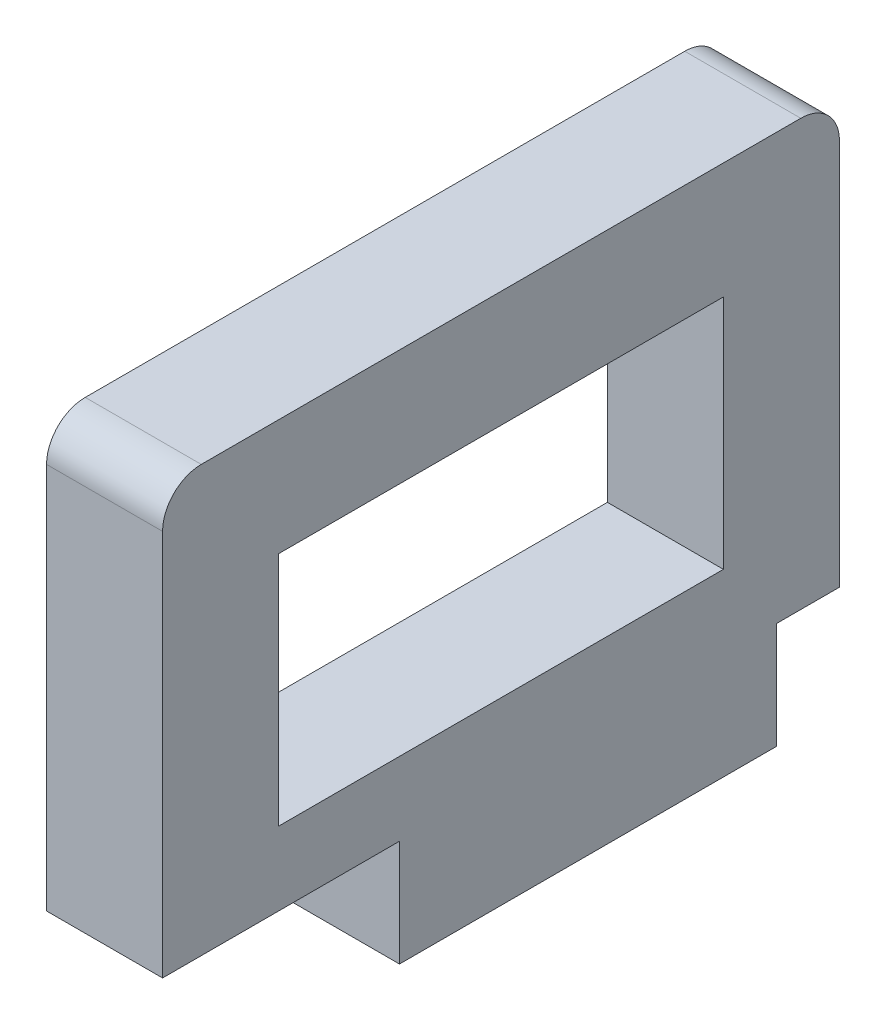
ISO-10303-21;
HEADER;
FILE_DESCRIPTION(('STEP AP214'),'2;1');
FILE_NAME('part.step','',(''),(''),'','','');
FILE_SCHEMA(('AUTOMOTIVE_DESIGN { 1 0 10303 214 1 1 1 1 }'));
ENDSEC;
DATA;
#1=APPLICATION_CONTEXT('core data for automotive mechanical design processes');
#2=APPLICATION_PROTOCOL_DEFINITION('international standard','automotive_design',2000,#1);
#3=PRODUCT_CONTEXT('',#1,'mechanical');
#4=PRODUCT('Part','Part','',(#3));
#5=PRODUCT_RELATED_PRODUCT_CATEGORY('part','',(#4));
#6=PRODUCT_DEFINITION_FORMATION('','',#4);
#7=PRODUCT_DEFINITION_CONTEXT('part definition',#1,'design');
#8=PRODUCT_DEFINITION('design','',#6,#7);
#9=PRODUCT_DEFINITION_SHAPE('','',#8);
#10=(LENGTH_UNIT() NAMED_UNIT(*) SI_UNIT(.MILLI.,.METRE.));
#11=(NAMED_UNIT(*) PLANE_ANGLE_UNIT() SI_UNIT($,.RADIAN.));
#12=(NAMED_UNIT(*) SI_UNIT($,.STERADIAN.) SOLID_ANGLE_UNIT());
#13=UNCERTAINTY_MEASURE_WITH_UNIT(LENGTH_MEASURE(1.E-05),#10,'distance_accuracy_value','');
#14=(GEOMETRIC_REPRESENTATION_CONTEXT(3) GLOBAL_UNCERTAINTY_ASSIGNED_CONTEXT((#13)) GLOBAL_UNIT_ASSIGNED_CONTEXT((#10,
#11,#12)) REPRESENTATION_CONTEXT('',''));
#15=CARTESIAN_POINT('',(0.,0.,0.));
#16=DIRECTION('',(0.,0.,1.));
#17=DIRECTION('',(1.,0.,0.));
#18=AXIS2_PLACEMENT_3D('',#15,#16,#17);
#19=CARTESIAN_POINT('',(6.,0.,0.));
#20=DIRECTION('',(1.,0.,0.));
#21=DIRECTION('',(0.,0.,-1.));
#22=AXIS2_PLACEMENT_3D('',#19,#20,#21);
#23=PLANE('',#22);
#24=DIRECTION('',(0.,0.,1.));
#25=VECTOR('',#24,1.);
#26=CARTESIAN_POINT('',(6.,12.1,-17.5));
#27=LINE('',#26,#25);
#28=CARTESIAN_POINT('',(6.,12.1,-15.5));
#29=VERTEX_POINT('',#28);
#30=CARTESIAN_POINT('',(6.,12.1,15.5));
#31=VERTEX_POINT('',#30);
#32=EDGE_CURVE('E178',#29,#31,#27,.T.);
#33=ORIENTED_EDGE('',*,*,#32,.T.);
#34=CARTESIAN_POINT('',(6.,10.1,15.5));
#35=DIRECTION('',(1.,0.,0.));
#36=DIRECTION('',(0.,0.,-1.));
#37=AXIS2_PLACEMENT_3D('',#34,#35,#36);
#38=CIRCLE('',#37,2.);
#39=CARTESIAN_POINT('',(6.,10.1,17.5));
#40=VERTEX_POINT('',#39);
#41=EDGE_CURVE('E41',#31,#40,#38,.T.);
#42=ORIENTED_EDGE('',*,*,#41,.T.);
#43=DIRECTION('',(0.,-1.,0.));
#44=VECTOR('',#43,1.);
#45=CARTESIAN_POINT('',(6.,12.1,17.5));
#46=LINE('',#45,#44);
#47=CARTESIAN_POINT('',(6.,-9.90000000000001,17.5));
#48=VERTEX_POINT('',#47);
#49=EDGE_CURVE('E180',#40,#48,#46,.T.);
#50=ORIENTED_EDGE('',*,*,#49,.T.);
#51=DIRECTION('',(0.,0.,-1.));
#52=VECTOR('',#51,1.);
#53=CARTESIAN_POINT('',(6.,-9.90000000000001,17.5));
#54=LINE('',#53,#52);
#55=CARTESIAN_POINT('',(6.,-9.90000000000001,5.24999999999999));
#56=VERTEX_POINT('',#55);
#57=EDGE_CURVE('E183',#48,#56,#54,.T.);
#58=ORIENTED_EDGE('',*,*,#57,.T.);
#59=DIRECTION('',(0.,-1.,0.));
#60=VECTOR('',#59,1.);
#61=CARTESIAN_POINT('',(6.,-9.90000000000001,5.24999999999999));
#62=LINE('',#61,#60);
#63=CARTESIAN_POINT('',(6.,-15.4,5.24999999999999));
#64=VERTEX_POINT('',#63);
#65=EDGE_CURVE('E185',#56,#64,#62,.T.);
#66=ORIENTED_EDGE('',*,*,#65,.T.);
#67=DIRECTION('',(0.,0.,-1.));
#68=VECTOR('',#67,1.);
#69=CARTESIAN_POINT('',(6.,-15.4,5.24999999999999));
#70=LINE('',#69,#68);
#71=CARTESIAN_POINT('',(6.,-15.4,-14.25));
#72=VERTEX_POINT('',#71);
#73=EDGE_CURVE('E187',#64,#72,#70,.T.);
#74=ORIENTED_EDGE('',*,*,#73,.T.);
#75=DIRECTION('',(0.,1.,0.));
#76=VECTOR('',#75,1.);
#77=CARTESIAN_POINT('',(6.,-15.4,-14.25));
#78=LINE('',#77,#76);
#79=CARTESIAN_POINT('',(6.,-9.90000000000001,-14.25));
#80=VERTEX_POINT('',#79);
#81=EDGE_CURVE('E189',#72,#80,#78,.T.);
#82=ORIENTED_EDGE('',*,*,#81,.T.);
#83=DIRECTION('',(0.,0.,-1.));
#84=VECTOR('',#83,1.);
#85=CARTESIAN_POINT('',(6.,-9.90000000000001,-14.25));
#86=LINE('',#85,#84);
#87=CARTESIAN_POINT('',(6.,-9.9,-17.5));
#88=VERTEX_POINT('',#87);
#89=EDGE_CURVE('E191',#80,#88,#86,.T.);
#90=ORIENTED_EDGE('',*,*,#89,.T.);
#91=DIRECTION('',(0.,1.,0.));
#92=VECTOR('',#91,1.);
#93=CARTESIAN_POINT('',(6.,-9.9,-17.5));
#94=LINE('',#93,#92);
#95=CARTESIAN_POINT('',(6.,10.1,-17.5));
#96=VERTEX_POINT('',#95);
#97=EDGE_CURVE('E193',#88,#96,#94,.T.);
#98=ORIENTED_EDGE('',*,*,#97,.T.);
#99=CARTESIAN_POINT('',(6.,10.1,-15.5));
#100=DIRECTION('',(1.,0.,0.));
#101=DIRECTION('',(0.,0.,-1.));
#102=AXIS2_PLACEMENT_3D('',#99,#100,#101);
#103=CIRCLE('',#102,2.);
#104=EDGE_CURVE('E238',#96,#29,#103,.T.);
#105=ORIENTED_EDGE('',*,*,#104,.T.);
#106=EDGE_LOOP('',(#33,#42,#50,#58,#66,#74,#82,#90,#98,#105));
#107=FACE_BOUND('',#106,.T.);
#108=DIRECTION('',(0.,0.,1.));
#109=VECTOR('',#108,1.);
#110=CARTESIAN_POINT('',(6.,6.1,11.5));
#111=LINE('',#110,#109);
#112=CARTESIAN_POINT('',(6.,6.1,-11.5));
#113=VERTEX_POINT('',#112);
#114=CARTESIAN_POINT('',(6.,6.1,11.5));
#115=VERTEX_POINT('',#114);
#116=EDGE_CURVE('E147',#113,#115,#111,.T.);
#117=ORIENTED_EDGE('',*,*,#116,.F.);
#118=DIRECTION('',(0.,1.,0.));
#119=VECTOR('',#118,1.);
#120=CARTESIAN_POINT('',(6.,-6.1,-11.5));
#121=LINE('',#120,#119);
#122=CARTESIAN_POINT('',(6.,-6.1,-11.5));
#123=VERTEX_POINT('',#122);
#124=EDGE_CURVE('E137',#123,#113,#121,.T.);
#125=ORIENTED_EDGE('',*,*,#124,.F.);
#126=DIRECTION('',(0.,0.,-1.));
#127=VECTOR('',#126,1.);
#128=CARTESIAN_POINT('',(6.,-6.1,11.5));
#129=LINE('',#128,#127);
#130=CARTESIAN_POINT('',(6.,-6.1,11.5));
#131=VERTEX_POINT('',#130);
#132=EDGE_CURVE('E162',#131,#123,#129,.T.);
#133=ORIENTED_EDGE('',*,*,#132,.F.);
#134=DIRECTION('',(0.,-1.,0.));
#135=VECTOR('',#134,1.);
#136=CARTESIAN_POINT('',(6.,-6.1,11.5));
#137=LINE('',#136,#135);
#138=EDGE_CURVE('E160',#115,#131,#137,.T.);
#139=ORIENTED_EDGE('',*,*,#138,.F.);
#140=EDGE_LOOP('',(#117,#125,#133,#139));
#141=FACE_BOUND('',#140,.T.);
#142=ADVANCED_FACE('F33',(#107,#141),#23,.T.);
#143=CARTESIAN_POINT('',(0.,0.,0.));
#144=DIRECTION('',(1.,0.,0.));
#145=DIRECTION('',(0.,0.,-1.));
#146=AXIS2_PLACEMENT_3D('',#143,#144,#145);
#147=PLANE('',#146);
#148=DIRECTION('',(0.,-1.,0.));
#149=VECTOR('',#148,1.);
#150=CARTESIAN_POINT('',(0.,12.1,17.5));
#151=LINE('',#150,#149);
#152=CARTESIAN_POINT('',(0.,10.1,17.5));
#153=VERTEX_POINT('',#152);
#154=CARTESIAN_POINT('',(0.,-9.90000000000001,17.5));
#155=VERTEX_POINT('',#154);
#156=EDGE_CURVE('E197',#153,#155,#151,.T.);
#157=ORIENTED_EDGE('',*,*,#156,.F.);
#158=CARTESIAN_POINT('',(0.,10.1,15.5));
#159=DIRECTION('',(1.,0.,0.));
#160=DIRECTION('',(0.,0.,-1.));
#161=AXIS2_PLACEMENT_3D('',#158,#159,#160);
#162=CIRCLE('',#161,2.);
#163=CARTESIAN_POINT('',(0.,12.1,15.5));
#164=VERTEX_POINT('',#163);
#165=EDGE_CURVE('E232',#153,#164,#162,.F.);
#166=ORIENTED_EDGE('',*,*,#165,.T.);
#167=DIRECTION('',(0.,0.,1.));
#168=VECTOR('',#167,1.);
#169=CARTESIAN_POINT('',(0.,12.1,-17.5));
#170=LINE('',#169,#168);
#171=CARTESIAN_POINT('',(0.,12.1,-15.5));
#172=VERTEX_POINT('',#171);
#173=EDGE_CURVE('E155',#172,#164,#170,.T.);
#174=ORIENTED_EDGE('',*,*,#173,.F.);
#175=CARTESIAN_POINT('',(0.,10.1,-15.5));
#176=DIRECTION('',(1.,0.,0.));
#177=DIRECTION('',(0.,0.,-1.));
#178=AXIS2_PLACEMENT_3D('',#175,#176,#177);
#179=CIRCLE('',#178,2.);
#180=CARTESIAN_POINT('',(0.,10.1,-17.5));
#181=VERTEX_POINT('',#180);
#182=EDGE_CURVE('E230',#172,#181,#179,.F.);
#183=ORIENTED_EDGE('',*,*,#182,.T.);
#184=DIRECTION('',(0.,1.,0.));
#185=VECTOR('',#184,1.);
#186=CARTESIAN_POINT('',(0.,-9.9,-17.5));
#187=LINE('',#186,#185);
#188=CARTESIAN_POINT('',(0.,-9.9,-17.5));
#189=VERTEX_POINT('',#188);
#190=EDGE_CURVE('E181',#189,#181,#187,.T.);
#191=ORIENTED_EDGE('',*,*,#190,.F.);
#192=DIRECTION('',(0.,0.,-1.));
#193=VECTOR('',#192,1.);
#194=CARTESIAN_POINT('',(0.,-9.90000000000001,-14.25));
#195=LINE('',#194,#193);
#196=CARTESIAN_POINT('',(0.,-9.90000000000001,-14.25));
#197=VERTEX_POINT('',#196);
#198=EDGE_CURVE('E207',#197,#189,#195,.T.);
#199=ORIENTED_EDGE('',*,*,#198,.F.);
#200=DIRECTION('',(0.,1.,0.));
#201=VECTOR('',#200,1.);
#202=CARTESIAN_POINT('',(0.,-15.4,-14.25));
#203=LINE('',#202,#201);
#204=CARTESIAN_POINT('',(0.,-15.4,-14.25));
#205=VERTEX_POINT('',#204);
#206=EDGE_CURVE('E205',#205,#197,#203,.T.);
#207=ORIENTED_EDGE('',*,*,#206,.F.);
#208=DIRECTION('',(0.,0.,-1.));
#209=VECTOR('',#208,1.);
#210=CARTESIAN_POINT('',(0.,-15.4,5.24999999999999));
#211=LINE('',#210,#209);
#212=CARTESIAN_POINT('',(0.,-15.4,5.24999999999999));
#213=VERTEX_POINT('',#212);
#214=EDGE_CURVE('E203',#213,#205,#211,.T.);
#215=ORIENTED_EDGE('',*,*,#214,.F.);
#216=DIRECTION('',(0.,-1.,0.));
#217=VECTOR('',#216,1.);
#218=CARTESIAN_POINT('',(0.,-9.90000000000001,5.24999999999999));
#219=LINE('',#218,#217);
#220=CARTESIAN_POINT('',(0.,-9.90000000000001,5.24999999999999));
#221=VERTEX_POINT('',#220);
#222=EDGE_CURVE('E201',#221,#213,#219,.T.);
#223=ORIENTED_EDGE('',*,*,#222,.F.);
#224=DIRECTION('',(0.,0.,-1.));
#225=VECTOR('',#224,1.);
#226=CARTESIAN_POINT('',(0.,-9.90000000000001,17.5));
#227=LINE('',#226,#225);
#228=EDGE_CURVE('E199',#155,#221,#227,.T.);
#229=ORIENTED_EDGE('',*,*,#228,.F.);
#230=EDGE_LOOP('',(#157,#166,#174,#183,#191,#199,#207,#215,#223,#229));
#231=FACE_BOUND('',#230,.T.);
#232=DIRECTION('',(0.,1.,0.));
#233=VECTOR('',#232,1.);
#234=CARTESIAN_POINT('',(0.,-6.1,-11.5));
#235=LINE('',#234,#233);
#236=CARTESIAN_POINT('',(0.,-6.1,-11.5));
#237=VERTEX_POINT('',#236);
#238=CARTESIAN_POINT('',(0.,6.1,-11.5));
#239=VERTEX_POINT('',#238);
#240=EDGE_CURVE('E166',#237,#239,#235,.T.);
#241=ORIENTED_EDGE('',*,*,#240,.T.);
#242=DIRECTION('',(0.,0.,1.));
#243=VECTOR('',#242,1.);
#244=CARTESIAN_POINT('',(0.,6.1,11.5));
#245=LINE('',#244,#243);
#246=CARTESIAN_POINT('',(0.,6.1,11.5));
#247=VERTEX_POINT('',#246);
#248=EDGE_CURVE('E154',#239,#247,#245,.T.);
#249=ORIENTED_EDGE('',*,*,#248,.T.);
#250=DIRECTION('',(0.,-1.,0.));
#251=VECTOR('',#250,1.);
#252=CARTESIAN_POINT('',(0.,-6.1,11.5));
#253=LINE('',#252,#251);
#254=CARTESIAN_POINT('',(0.,-6.1,11.5));
#255=VERTEX_POINT('',#254);
#256=EDGE_CURVE('E169',#247,#255,#253,.T.);
#257=ORIENTED_EDGE('',*,*,#256,.T.);
#258=DIRECTION('',(0.,0.,-1.));
#259=VECTOR('',#258,1.);
#260=CARTESIAN_POINT('',(0.,-6.1,11.5));
#261=LINE('',#260,#259);
#262=EDGE_CURVE('E148',#255,#237,#261,.T.);
#263=ORIENTED_EDGE('',*,*,#262,.T.);
#264=EDGE_LOOP('',(#241,#249,#257,#263));
#265=FACE_BOUND('',#264,.T.);
#266=ADVANCED_FACE('F252',(#231,#265),#147,.F.);
#267=CARTESIAN_POINT('',(6.,12.1,-17.5));
#268=DIRECTION('',(0.,-1.,0.));
#269=DIRECTION('',(0.,0.,-1.));
#270=AXIS2_PLACEMENT_3D('',#267,#268,#269);
#271=PLANE('',#270);
#272=ORIENTED_EDGE('',*,*,#173,.T.);
#273=DIRECTION('',(-1.,0.,0.));
#274=VECTOR('',#273,1.);
#275=CARTESIAN_POINT('',(6.,12.1,15.5));
#276=LINE('',#275,#274);
#277=EDGE_CURVE('E54',#164,#31,#276,.F.);
#278=ORIENTED_EDGE('',*,*,#277,.T.);
#279=ORIENTED_EDGE('',*,*,#32,.F.);
#280=DIRECTION('',(-1.,0.,0.));
#281=VECTOR('',#280,1.);
#282=CARTESIAN_POINT('',(6.,12.1,-15.5));
#283=LINE('',#282,#281);
#284=EDGE_CURVE('E234',#29,#172,#283,.T.);
#285=ORIENTED_EDGE('',*,*,#284,.T.);
#286=EDGE_LOOP('',(#272,#278,#279,#285));
#287=FACE_BOUND('',#286,.T.);
#288=ADVANCED_FACE('F255',(#287),#271,.F.);
#289=CARTESIAN_POINT('',(6.,12.1,17.5));
#290=DIRECTION('',(0.,0.,-1.));
#291=DIRECTION('',(0.,1.,0.));
#292=AXIS2_PLACEMENT_3D('',#289,#290,#291);
#293=PLANE('',#292);
#294=ORIENTED_EDGE('',*,*,#49,.F.);
#295=DIRECTION('',(-1.,0.,0.));
#296=VECTOR('',#295,1.);
#297=CARTESIAN_POINT('',(6.,10.1,17.5));
#298=LINE('',#297,#296);
#299=EDGE_CURVE('E227',#40,#153,#298,.T.);
#300=ORIENTED_EDGE('',*,*,#299,.T.);
#301=ORIENTED_EDGE('',*,*,#156,.T.);
#302=DIRECTION('',(-1.,0.,0.));
#303=VECTOR('',#302,1.);
#304=CARTESIAN_POINT('',(6.,-9.90000000000001,17.5));
#305=LINE('',#304,#303);
#306=EDGE_CURVE('E224',#48,#155,#305,.T.);
#307=ORIENTED_EDGE('',*,*,#306,.F.);
#308=EDGE_LOOP('',(#294,#300,#301,#307));
#309=FACE_BOUND('',#308,.T.);
#310=ADVANCED_FACE('F246',(#309),#293,.F.);
#311=CARTESIAN_POINT('',(6.,-9.90000000000001,17.5));
#312=DIRECTION('',(0.,1.,0.));
#313=DIRECTION('',(0.,0.,1.));
#314=AXIS2_PLACEMENT_3D('',#311,#312,#313);
#315=PLANE('',#314);
#316=ORIENTED_EDGE('',*,*,#228,.T.);
#317=DIRECTION('',(-1.,0.,0.));
#318=VECTOR('',#317,1.);
#319=CARTESIAN_POINT('',(6.,-9.90000000000001,5.24999999999999));
#320=LINE('',#319,#318);
#321=EDGE_CURVE('E221',#56,#221,#320,.T.);
#322=ORIENTED_EDGE('',*,*,#321,.F.);
#323=ORIENTED_EDGE('',*,*,#57,.F.);
#324=ORIENTED_EDGE('',*,*,#306,.T.);
#325=EDGE_LOOP('',(#316,#322,#323,#324));
#326=FACE_BOUND('',#325,.T.);
#327=ADVANCED_FACE('F283',(#326),#315,.F.);
#328=CARTESIAN_POINT('',(6.,-9.90000000000001,5.24999999999999));
#329=DIRECTION('',(0.,0.,-1.));
#330=DIRECTION('',(-1.,0.,0.));
#331=AXIS2_PLACEMENT_3D('',#328,#329,#330);
#332=PLANE('',#331);
#333=ORIENTED_EDGE('',*,*,#222,.T.);
#334=DIRECTION('',(-1.,0.,0.));
#335=VECTOR('',#334,1.);
#336=CARTESIAN_POINT('',(6.,-15.4,5.24999999999999));
#337=LINE('',#336,#335);
#338=EDGE_CURVE('E218',#64,#213,#337,.T.);
#339=ORIENTED_EDGE('',*,*,#338,.F.);
#340=ORIENTED_EDGE('',*,*,#65,.F.);
#341=ORIENTED_EDGE('',*,*,#321,.T.);
#342=EDGE_LOOP('',(#333,#339,#340,#341));
#343=FACE_BOUND('',#342,.T.);
#344=ADVANCED_FACE('F280',(#343),#332,.F.);
#345=CARTESIAN_POINT('',(6.,-15.4,5.24999999999999));
#346=DIRECTION('',(0.,1.,0.));
#347=DIRECTION('',(0.,0.,1.));
#348=AXIS2_PLACEMENT_3D('',#345,#346,#347);
#349=PLANE('',#348);
#350=ORIENTED_EDGE('',*,*,#214,.T.);
#351=DIRECTION('',(-1.,0.,0.));
#352=VECTOR('',#351,1.);
#353=CARTESIAN_POINT('',(6.,-15.4,-14.25));
#354=LINE('',#353,#352);
#355=EDGE_CURVE('E215',#72,#205,#354,.T.);
#356=ORIENTED_EDGE('',*,*,#355,.F.);
#357=ORIENTED_EDGE('',*,*,#73,.F.);
#358=ORIENTED_EDGE('',*,*,#338,.T.);
#359=EDGE_LOOP('',(#350,#356,#357,#358));
#360=FACE_BOUND('',#359,.T.);
#361=ADVANCED_FACE('F276',(#360),#349,.F.);
#362=CARTESIAN_POINT('',(6.,-15.4,-14.25));
#363=DIRECTION('',(0.,0.,1.));
#364=DIRECTION('',(0.,-1.,0.));
#365=AXIS2_PLACEMENT_3D('',#362,#363,#364);
#366=PLANE('',#365);
#367=ORIENTED_EDGE('',*,*,#206,.T.);
#368=DIRECTION('',(-1.,0.,0.));
#369=VECTOR('',#368,1.);
#370=CARTESIAN_POINT('',(6.,-9.90000000000001,-14.25));
#371=LINE('',#370,#369);
#372=EDGE_CURVE('E212',#80,#197,#371,.T.);
#373=ORIENTED_EDGE('',*,*,#372,.F.);
#374=ORIENTED_EDGE('',*,*,#81,.F.);
#375=ORIENTED_EDGE('',*,*,#355,.T.);
#376=EDGE_LOOP('',(#367,#373,#374,#375));
#377=FACE_BOUND('',#376,.T.);
#378=ADVANCED_FACE('F271',(#377),#366,.F.);
#379=CARTESIAN_POINT('',(6.,-9.90000000000001,-14.25));
#380=DIRECTION('',(0.,1.,0.));
#381=DIRECTION('',(0.,0.,1.));
#382=AXIS2_PLACEMENT_3D('',#379,#380,#381);
#383=PLANE('',#382);
#384=ORIENTED_EDGE('',*,*,#198,.T.);
#385=DIRECTION('',(-1.,0.,0.));
#386=VECTOR('',#385,1.);
#387=CARTESIAN_POINT('',(6.,-9.9,-17.5));
#388=LINE('',#387,#386);
#389=EDGE_CURVE('E195',#88,#189,#388,.T.);
#390=ORIENTED_EDGE('',*,*,#389,.F.);
#391=ORIENTED_EDGE('',*,*,#89,.F.);
#392=ORIENTED_EDGE('',*,*,#372,.T.);
#393=EDGE_LOOP('',(#384,#390,#391,#392));
#394=FACE_BOUND('',#393,.T.);
#395=ADVANCED_FACE('F265',(#394),#383,.F.);
#396=CARTESIAN_POINT('',(6.,-9.9,-17.5));
#397=DIRECTION('',(0.,0.,1.));
#398=DIRECTION('',(0.,-1.,0.));
#399=AXIS2_PLACEMENT_3D('',#396,#397,#398);
#400=PLANE('',#399);
#401=ORIENTED_EDGE('',*,*,#190,.T.);
#402=DIRECTION('',(-1.,0.,0.));
#403=VECTOR('',#402,1.);
#404=CARTESIAN_POINT('',(6.,10.1,-17.5));
#405=LINE('',#404,#403);
#406=EDGE_CURVE('E11',#181,#96,#405,.F.);
#407=ORIENTED_EDGE('',*,*,#406,.T.);
#408=ORIENTED_EDGE('',*,*,#97,.F.);
#409=ORIENTED_EDGE('',*,*,#389,.T.);
#410=EDGE_LOOP('',(#401,#407,#408,#409));
#411=FACE_BOUND('',#410,.T.);
#412=ADVANCED_FACE('F261',(#411),#400,.F.);
#413=CARTESIAN_POINT('',(6.,-6.1,-11.5));
#414=DIRECTION('',(0.,0.,1.));
#415=DIRECTION('',(1.,0.,0.));
#416=AXIS2_PLACEMENT_3D('',#413,#414,#415);
#417=PLANE('',#416);
#418=ORIENTED_EDGE('',*,*,#240,.F.);
#419=DIRECTION('',(-1.,0.,0.));
#420=VECTOR('',#419,1.);
#421=CARTESIAN_POINT('',(6.,-6.1,-11.5));
#422=LINE('',#421,#420);
#423=EDGE_CURVE('E143',#123,#237,#422,.T.);
#424=ORIENTED_EDGE('',*,*,#423,.F.);
#425=ORIENTED_EDGE('',*,*,#124,.T.);
#426=DIRECTION('',(-1.,0.,0.));
#427=VECTOR('',#426,1.);
#428=CARTESIAN_POINT('',(6.,6.1,-11.5));
#429=LINE('',#428,#427);
#430=EDGE_CURVE('E140',#113,#239,#429,.T.);
#431=ORIENTED_EDGE('',*,*,#430,.T.);
#432=EDGE_LOOP('',(#418,#424,#425,#431));
#433=FACE_BOUND('',#432,.T.);
#434=ADVANCED_FACE('F139',(#433),#417,.T.);
#435=CARTESIAN_POINT('',(6.,6.1,11.5));
#436=DIRECTION('',(0.,-1.,0.));
#437=DIRECTION('',(0.,0.,-1.));
#438=AXIS2_PLACEMENT_3D('',#435,#436,#437);
#439=PLANE('',#438);
#440=ORIENTED_EDGE('',*,*,#248,.F.);
#441=ORIENTED_EDGE('',*,*,#430,.F.);
#442=ORIENTED_EDGE('',*,*,#116,.T.);
#443=DIRECTION('',(-1.,0.,0.));
#444=VECTOR('',#443,1.);
#445=CARTESIAN_POINT('',(6.,6.1,11.5));
#446=LINE('',#445,#444);
#447=EDGE_CURVE('E156',#115,#247,#446,.T.);
#448=ORIENTED_EDGE('',*,*,#447,.T.);
#449=EDGE_LOOP('',(#440,#441,#442,#448));
#450=FACE_BOUND('',#449,.T.);
#451=ADVANCED_FACE('F151',(#450),#439,.T.);
#452=CARTESIAN_POINT('',(6.,-6.1,11.5));
#453=DIRECTION('',(0.,0.,-1.));
#454=DIRECTION('',(-1.,0.,0.));
#455=AXIS2_PLACEMENT_3D('',#452,#453,#454);
#456=PLANE('',#455);
#457=ORIENTED_EDGE('',*,*,#256,.F.);
#458=ORIENTED_EDGE('',*,*,#447,.F.);
#459=ORIENTED_EDGE('',*,*,#138,.T.);
#460=DIRECTION('',(-1.,0.,0.));
#461=VECTOR('',#460,1.);
#462=CARTESIAN_POINT('',(6.,-6.1,11.5));
#463=LINE('',#462,#461);
#464=EDGE_CURVE('E175',#131,#255,#463,.T.);
#465=ORIENTED_EDGE('',*,*,#464,.T.);
#466=EDGE_LOOP('',(#457,#458,#459,#465));
#467=FACE_BOUND('',#466,.T.);
#468=ADVANCED_FACE('F337',(#467),#456,.T.);
#469=CARTESIAN_POINT('',(6.,-6.1,11.5));
#470=DIRECTION('',(0.,1.,0.));
#471=DIRECTION('',(0.,0.,1.));
#472=AXIS2_PLACEMENT_3D('',#469,#470,#471);
#473=PLANE('',#472);
#474=ORIENTED_EDGE('',*,*,#262,.F.);
#475=ORIENTED_EDGE('',*,*,#464,.F.);
#476=ORIENTED_EDGE('',*,*,#132,.T.);
#477=ORIENTED_EDGE('',*,*,#423,.T.);
#478=EDGE_LOOP('',(#474,#475,#476,#477));
#479=FACE_BOUND('',#478,.T.);
#480=ADVANCED_FACE('F343',(#479),#473,.T.);
#481=CARTESIAN_POINT('',(6.,10.1,15.5));
#482=DIRECTION('',(-1.,0.,0.));
#483=DIRECTION('',(0.,0.,1.));
#484=AXIS2_PLACEMENT_3D('',#481,#482,#483);
#485=CYLINDRICAL_SURFACE('',#484,2.);
#486=ORIENTED_EDGE('',*,*,#41,.F.);
#487=ORIENTED_EDGE('',*,*,#277,.F.);
#488=ORIENTED_EDGE('',*,*,#165,.F.);
#489=ORIENTED_EDGE('',*,*,#299,.F.);
#490=EDGE_LOOP('',(#486,#487,#488,#489));
#491=FACE_BOUND('',#490,.T.);
#492=ADVANCED_FACE('F249',(#491),#485,.T.);
#493=CARTESIAN_POINT('',(6.,10.1,-15.5));
#494=DIRECTION('',(-1.,0.,0.));
#495=DIRECTION('',(0.,0.,1.));
#496=AXIS2_PLACEMENT_3D('',#493,#494,#495);
#497=CYLINDRICAL_SURFACE('',#496,2.);
#498=ORIENTED_EDGE('',*,*,#104,.F.);
#499=ORIENTED_EDGE('',*,*,#406,.F.);
#500=ORIENTED_EDGE('',*,*,#182,.F.);
#501=ORIENTED_EDGE('',*,*,#284,.F.);
#502=EDGE_LOOP('',(#498,#499,#500,#501));
#503=FACE_BOUND('',#502,.T.);
#504=ADVANCED_FACE('F35',(#503),#497,.T.);
#505=CLOSED_SHELL('',(#142,#266,#288,#310,#327,#344,#361,#378,#395,#412,#434,#451,#468,#480,
#492,#504));
#506=MANIFOLD_SOLID_BREP('B2',#505);
#507=ADVANCED_BREP_SHAPE_REPRESENTATION('',(#18,#506),#14);
#508=SHAPE_DEFINITION_REPRESENTATION(#9,#507);
ENDSEC;
END-ISO-10303-21;
